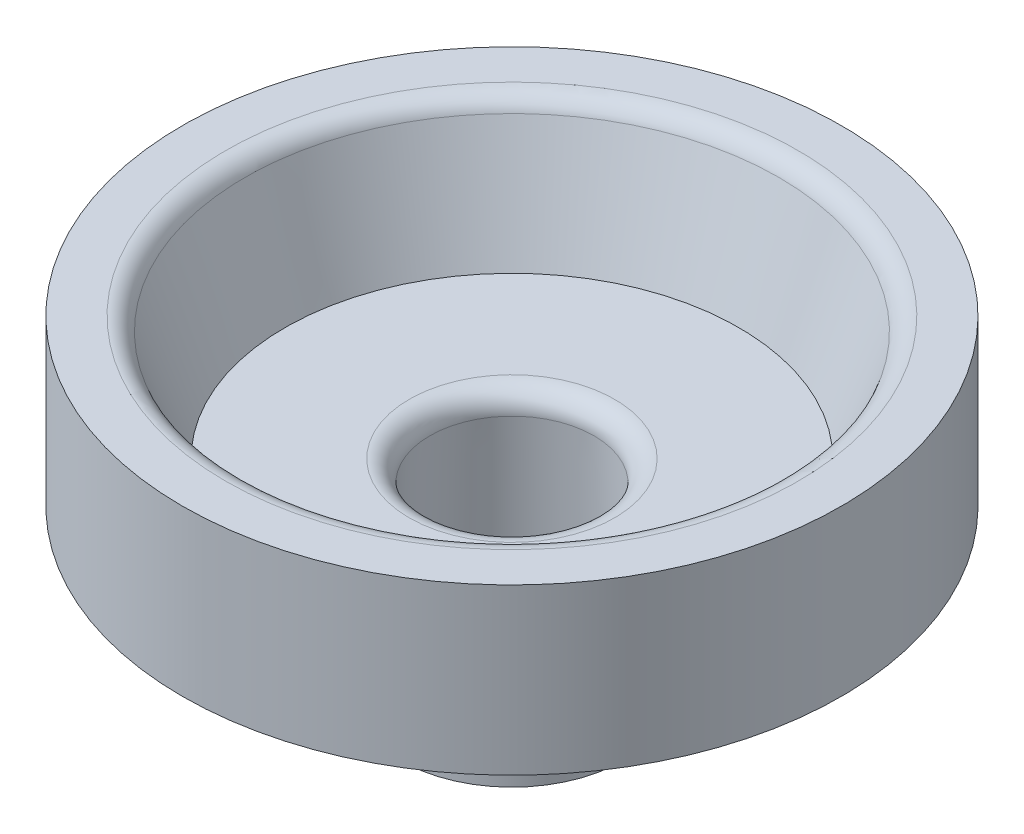
ISO-10303-21;
HEADER;
FILE_DESCRIPTION(('STEP AP214'),'2;1');
FILE_NAME('part.step','',(''),(''),'','','');
FILE_SCHEMA(('AUTOMOTIVE_DESIGN { 1 0 10303 214 1 1 1 1 }'));
ENDSEC;
DATA;
#1=APPLICATION_CONTEXT('core data for automotive mechanical design processes');
#2=APPLICATION_PROTOCOL_DEFINITION('international standard','automotive_design',2000,#1);
#3=PRODUCT_CONTEXT('',#1,'mechanical');
#4=PRODUCT('Part','Part','',(#3));
#5=PRODUCT_RELATED_PRODUCT_CATEGORY('part','',(#4));
#6=PRODUCT_DEFINITION_FORMATION('','',#4);
#7=PRODUCT_DEFINITION_CONTEXT('part definition',#1,'design');
#8=PRODUCT_DEFINITION('design','',#6,#7);
#9=PRODUCT_DEFINITION_SHAPE('','',#8);
#10=(LENGTH_UNIT() NAMED_UNIT(*) SI_UNIT(.MILLI.,.METRE.));
#11=(NAMED_UNIT(*) PLANE_ANGLE_UNIT() SI_UNIT($,.RADIAN.));
#12=(NAMED_UNIT(*) SI_UNIT($,.STERADIAN.) SOLID_ANGLE_UNIT());
#13=UNCERTAINTY_MEASURE_WITH_UNIT(LENGTH_MEASURE(1.E-05),#10,'distance_accuracy_value','');
#14=(GEOMETRIC_REPRESENTATION_CONTEXT(3) GLOBAL_UNCERTAINTY_ASSIGNED_CONTEXT((#13)) GLOBAL_UNIT_ASSIGNED_CONTEXT((#10,
#11,#12)) REPRESENTATION_CONTEXT('',''));
#15=CARTESIAN_POINT('',(0.,0.,0.));
#16=DIRECTION('',(0.,0.,1.));
#17=DIRECTION('',(1.,0.,0.));
#18=AXIS2_PLACEMENT_3D('',#15,#16,#17);
#19=CARTESIAN_POINT('',(-48.4143224748866,4.,0.));
#20=DIRECTION('',(0.,-1.,0.));
#21=DIRECTION('',(0.,0.,-1.));
#22=AXIS2_PLACEMENT_3D('',#19,#20,#21);
#23=CYLINDRICAL_SURFACE('',#22,8.);
#24=CARTESIAN_POINT('',(-48.4143224748866,4.,0.));
#25=DIRECTION('',(0.,1.,0.));
#26=DIRECTION('',(0.,0.,1.));
#27=AXIS2_PLACEMENT_3D('',#24,#25,#26);
#28=CIRCLE('',#27,8.);
#29=CARTESIAN_POINT('',(-48.4143224748866,4.,8.));
#30=VERTEX_POINT('',#29);
#31=EDGE_CURVE('E74',#30,#30,#28,.T.);
#32=ORIENTED_EDGE('',*,*,#31,.F.);
#33=EDGE_LOOP('',(#32));
#34=FACE_BOUND('',#33,.T.);
#35=CARTESIAN_POINT('',(-48.4143224748866,0.,0.));
#36=DIRECTION('',(0.,1.,0.));
#37=DIRECTION('',(0.,0.,1.));
#38=AXIS2_PLACEMENT_3D('',#35,#36,#37);
#39=CIRCLE('',#38,8.);
#40=CARTESIAN_POINT('',(-48.4143224748866,0.,8.));
#41=VERTEX_POINT('',#40);
#42=EDGE_CURVE('E70',#41,#41,#39,.T.);
#43=ORIENTED_EDGE('',*,*,#42,.T.);
#44=EDGE_LOOP('',(#43));
#45=FACE_BOUND('',#44,.T.);
#46=ADVANCED_FACE('F37',(#34,#45),#23,.T.);
#47=CARTESIAN_POINT('',(-48.4143224748866,4.,0.));
#48=DIRECTION('',(0.,1.,0.));
#49=DIRECTION('',(0.,0.,1.));
#50=AXIS2_PLACEMENT_3D('',#47,#48,#49);
#51=PLANE('',#50);
#52=CARTESIAN_POINT('',(-48.4143224748866,4.,0.));
#53=DIRECTION('',(0.,1.,0.));
#54=DIRECTION('',(0.,0.,1.));
#55=AXIS2_PLACEMENT_3D('',#52,#53,#54);
#56=CIRCLE('',#55,6.95010376910486);
#57=CARTESIAN_POINT('',(-48.4143224748866,4.,6.95010376910486));
#58=VERTEX_POINT('',#57);
#59=EDGE_CURVE('E10',#58,#58,#56,.F.);
#60=ORIENTED_EDGE('',*,*,#59,.T.);
#61=EDGE_LOOP('',(#60));
#62=FACE_BOUND('',#61,.T.);
#63=ORIENTED_EDGE('',*,*,#31,.T.);
#64=EDGE_LOOP('',(#63));
#65=FACE_BOUND('',#64,.T.);
#66=ADVANCED_FACE('F103',(#62,#65),#51,.T.);
#67=CARTESIAN_POINT('',(-48.4143224748866,0.,0.));
#68=DIRECTION('',(0.,1.,0.));
#69=DIRECTION('',(0.,0.,1.));
#70=AXIS2_PLACEMENT_3D('',#67,#68,#69);
#71=PLANE('',#70);
#72=CARTESIAN_POINT('',(-48.4143224748866,0.,0.));
#73=DIRECTION('',(0.,-1.,0.));
#74=DIRECTION('',(0.,0.,-1.));
#75=AXIS2_PLACEMENT_3D('',#72,#73,#74);
#76=CIRCLE('',#75,2.7);
#77=CARTESIAN_POINT('',(-48.4143224748866,0.,-2.7));
#78=VERTEX_POINT('',#77);
#79=EDGE_CURVE('E69',#78,#78,#76,.T.);
#80=ORIENTED_EDGE('',*,*,#79,.F.);
#81=EDGE_LOOP('',(#80));
#82=FACE_BOUND('',#81,.T.);
#83=ORIENTED_EDGE('',*,*,#42,.F.);
#84=EDGE_LOOP('',(#83));
#85=FACE_BOUND('',#84,.T.);
#86=ADVANCED_FACE('F99',(#82,#85),#71,.F.);
#87=CARTESIAN_POINT('',(-48.4143224748866,4.,0.));
#88=DIRECTION('',(0.,1.,0.));
#89=DIRECTION('',(0.,0.,1.));
#90=AXIS2_PLACEMENT_3D('',#87,#88,#89);
#91=CONICAL_SURFACE('',#90,6.6,0.349065850398867);
#92=CARTESIAN_POINT('',(-48.4143224748866,3.67101007166284,0.));
#93=DIRECTION('',(0.,1.,0.));
#94=DIRECTION('',(0.,0.,1.));
#95=AXIS2_PLACEMENT_3D('',#92,#93,#94);
#96=CIRCLE('',#95,6.4802574587119);
#97=CARTESIAN_POINT('',(-48.4143224748866,3.67101007166284,6.4802574587119));
#98=VERTEX_POINT('',#97);
#99=EDGE_CURVE('E45',#98,#98,#96,.T.);
#100=ORIENTED_EDGE('',*,*,#99,.T.);
#101=EDGE_LOOP('',(#100));
#102=FACE_BOUND('',#101,.T.);
#103=CARTESIAN_POINT('',(-48.4143224748866,1.,0.));
#104=DIRECTION('',(0.,1.,0.));
#105=DIRECTION('',(0.,0.,1.));
#106=AXIS2_PLACEMENT_3D('',#103,#104,#105);
#107=CIRCLE('',#106,5.50808929720139);
#108=CARTESIAN_POINT('',(-48.4143224748866,1.,5.50808929720139));
#109=VERTEX_POINT('',#108);
#110=EDGE_CURVE('E75',#109,#109,#107,.T.);
#111=ORIENTED_EDGE('',*,*,#110,.F.);
#112=EDGE_LOOP('',(#111));
#113=FACE_BOUND('',#112,.T.);
#114=ADVANCED_FACE('F102',(#102,#113),#91,.F.);
#115=CARTESIAN_POINT('',(-48.4143224748866,1.,0.));
#116=DIRECTION('',(0.,1.,0.));
#117=DIRECTION('',(0.,0.,1.));
#118=AXIS2_PLACEMENT_3D('',#115,#116,#117);
#119=PLANE('',#118);
#120=CARTESIAN_POINT('',(-48.4143224748866,1.,0.));
#121=DIRECTION('',(0.,1.,0.));
#122=DIRECTION('',(0.,0.,1.));
#123=AXIS2_PLACEMENT_3D('',#120,#121,#122);
#124=CIRCLE('',#123,2.49316130943655);
#125=CARTESIAN_POINT('',(-48.4143224748866,1.,2.49316130943655));
#126=VERTEX_POINT('',#125);
#127=EDGE_CURVE('E50',#126,#126,#124,.F.);
#128=ORIENTED_EDGE('',*,*,#127,.T.);
#129=EDGE_LOOP('',(#128));
#130=FACE_BOUND('',#129,.T.);
#131=ORIENTED_EDGE('',*,*,#110,.T.);
#132=EDGE_LOOP('',(#131));
#133=FACE_BOUND('',#132,.T.);
#134=ADVANCED_FACE('F95',(#130,#133),#119,.T.);
#135=CARTESIAN_POINT('',(-48.4143224748866,-4.,0.));
#136=DIRECTION('',(0.,1.,0.));
#137=DIRECTION('',(0.,0.,1.));
#138=AXIS2_PLACEMENT_3D('',#135,#136,#137);
#139=CYLINDRICAL_SURFACE('',#138,2.7);
#140=CARTESIAN_POINT('',(-48.4143224748866,-4.,0.));
#141=DIRECTION('',(0.,-1.,0.));
#142=DIRECTION('',(0.,0.,-1.));
#143=AXIS2_PLACEMENT_3D('',#140,#141,#142);
#144=CIRCLE('',#143,2.7);
#145=CARTESIAN_POINT('',(-48.4143224748866,-4.,-2.7));
#146=VERTEX_POINT('',#145);
#147=EDGE_CURVE('E82',#146,#146,#144,.T.);
#148=ORIENTED_EDGE('',*,*,#147,.F.);
#149=EDGE_LOOP('',(#148));
#150=FACE_BOUND('',#149,.T.);
#151=ORIENTED_EDGE('',*,*,#79,.T.);
#152=EDGE_LOOP('',(#151));
#153=FACE_BOUND('',#152,.T.);
#154=ADVANCED_FACE('F92',(#150,#153),#139,.T.);
#155=CARTESIAN_POINT('',(-48.4143224748866,-4.,0.));
#156=DIRECTION('',(0.,-1.,0.));
#157=DIRECTION('',(0.,0.,-1.));
#158=AXIS2_PLACEMENT_3D('',#155,#156,#157);
#159=PLANE('',#158);
#160=CARTESIAN_POINT('',(-48.4143224748866,-4.,0.));
#161=DIRECTION('',(0.,-1.,0.));
#162=DIRECTION('',(0.,0.,-1.));
#163=AXIS2_PLACEMENT_3D('',#160,#161,#162);
#164=CIRCLE('',#163,2.63284438740354);
#165=CARTESIAN_POINT('',(-48.4143224748866,-4.,-2.63284438740354));
#166=VERTEX_POINT('',#165);
#167=EDGE_CURVE('E55',#166,#166,#164,.F.);
#168=ORIENTED_EDGE('',*,*,#167,.T.);
#169=EDGE_LOOP('',(#168));
#170=FACE_BOUND('',#169,.T.);
#171=ORIENTED_EDGE('',*,*,#147,.T.);
#172=EDGE_LOOP('',(#171));
#173=FACE_BOUND('',#172,.T.);
#174=ADVANCED_FACE('F90',(#170,#173),#159,.T.);
#175=CARTESIAN_POINT('',(-48.4143224748866,-4.,0.));
#176=DIRECTION('',(0.,-1.,0.));
#177=DIRECTION('',(0.,0.,-1.));
#178=AXIS2_PLACEMENT_3D('',#175,#176,#177);
#179=CONICAL_SURFACE('',#178,2.15,0.0349065850398867);
#180=CARTESIAN_POINT('',(-48.4143224748866,-3.51744974835125,0.));
#181=DIRECTION('',(0.,-1.,0.));
#182=DIRECTION('',(0.,0.,-1.));
#183=AXIS2_PLACEMENT_3D('',#180,#181,#182);
#184=CIRCLE('',#183,2.13314897389399);
#185=CARTESIAN_POINT('',(-48.4143224748866,-3.51744974835125,-2.13314897389399));
#186=VERTEX_POINT('',#185);
#187=EDGE_CURVE('E61',#186,#186,#184,.T.);
#188=ORIENTED_EDGE('',*,*,#187,.T.);
#189=EDGE_LOOP('',(#188));
#190=FACE_BOUND('',#189,.T.);
#191=CARTESIAN_POINT('',(-48.4143224748866,0.482550251648749,0.));
#192=DIRECTION('',(0.,-1.,0.));
#193=DIRECTION('',(0.,0.,-1.));
#194=AXIS2_PLACEMENT_3D('',#191,#192,#193);
#195=CIRCLE('',#194,1.993465895927);
#196=CARTESIAN_POINT('',(-48.4143224748866,0.482550251648749,-1.993465895927));
#197=VERTEX_POINT('',#196);
#198=EDGE_CURVE('E65',#197,#197,#195,.F.);
#199=ORIENTED_EDGE('',*,*,#198,.T.);
#200=EDGE_LOOP('',(#199));
#201=FACE_BOUND('',#200,.T.);
#202=ADVANCED_FACE('F119',(#190,#201),#179,.F.);
#203=CARTESIAN_POINT('',(-48.4143224748866,-3.5,0.));
#204=DIRECTION('',(0.,-1.,0.));
#205=DIRECTION('',(0.,0.,-1.));
#206=AXIS2_PLACEMENT_3D('',#203,#204,#205);
#207=TOROIDAL_SURFACE('',#206,2.63284438740354,0.5);
#208=ORIENTED_EDGE('',*,*,#167,.F.);
#209=EDGE_LOOP('',(#208));
#210=FACE_BOUND('',#209,.T.);
#211=ORIENTED_EDGE('',*,*,#187,.F.);
#212=EDGE_LOOP('',(#211));
#213=FACE_BOUND('',#212,.T.);
#214=ADVANCED_FACE('F116',(#210,#213),#207,.T.);
#215=CARTESIAN_POINT('',(-48.4143224748866,0.5,0.));
#216=DIRECTION('',(0.,1.,0.));
#217=DIRECTION('',(0.,0.,1.));
#218=AXIS2_PLACEMENT_3D('',#215,#216,#217);
#219=TOROIDAL_SURFACE('',#218,2.49316130943655,0.5);
#220=ORIENTED_EDGE('',*,*,#127,.F.);
#221=EDGE_LOOP('',(#220));
#222=FACE_BOUND('',#221,.T.);
#223=ORIENTED_EDGE('',*,*,#198,.F.);
#224=EDGE_LOOP('',(#223));
#225=FACE_BOUND('',#224,.T.);
#226=ADVANCED_FACE('F118',(#222,#225),#219,.T.);
#227=CARTESIAN_POINT('',(-48.4143224748866,3.5,0.));
#228=DIRECTION('',(0.,1.,0.));
#229=DIRECTION('',(0.,0.,1.));
#230=AXIS2_PLACEMENT_3D('',#227,#228,#229);
#231=TOROIDAL_SURFACE('',#230,6.95010376910486,0.5);
#232=ORIENTED_EDGE('',*,*,#59,.F.);
#233=EDGE_LOOP('',(#232));
#234=FACE_BOUND('',#233,.T.);
#235=ORIENTED_EDGE('',*,*,#99,.F.);
#236=EDGE_LOOP('',(#235));
#237=FACE_BOUND('',#236,.T.);
#238=ADVANCED_FACE('F39',(#234,#237),#231,.T.);
#239=CLOSED_SHELL('',(#46,#66,#86,#114,#134,#154,#174,#202,#214,#226,#238));
#240=MANIFOLD_SOLID_BREP('B2',#239);
#241=ADVANCED_BREP_SHAPE_REPRESENTATION('',(#18,#240),#14);
#242=SHAPE_DEFINITION_REPRESENTATION(#9,#241);
ENDSEC;
END-ISO-10303-21;
